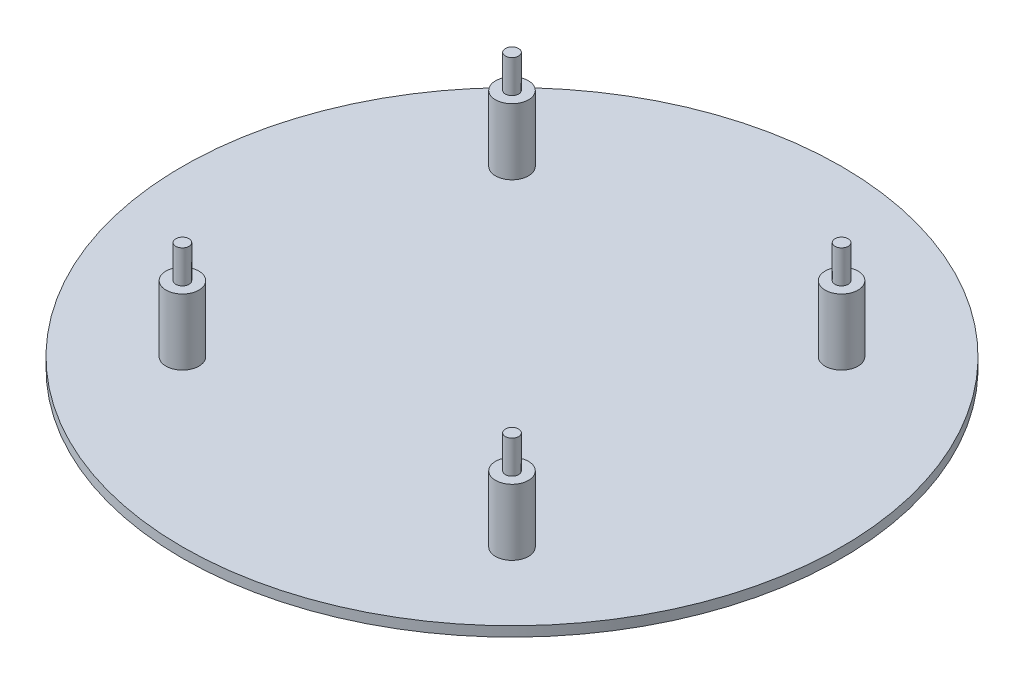
ISO-10303-21;
HEADER;
FILE_DESCRIPTION(('STEP AP214'),'2;1');
FILE_NAME('part.step','',(''),(''),'','','');
FILE_SCHEMA(('AUTOMOTIVE_DESIGN { 1 0 10303 214 1 1 1 1 }'));
ENDSEC;
DATA;
#1=APPLICATION_CONTEXT('core data for automotive mechanical design processes');
#2=APPLICATION_PROTOCOL_DEFINITION('international standard','automotive_design',2000,#1);
#3=PRODUCT_CONTEXT('',#1,'mechanical');
#4=PRODUCT('Part','Part','',(#3));
#5=PRODUCT_RELATED_PRODUCT_CATEGORY('part','',(#4));
#6=PRODUCT_DEFINITION_FORMATION('','',#4);
#7=PRODUCT_DEFINITION_CONTEXT('part definition',#1,'design');
#8=PRODUCT_DEFINITION('design','',#6,#7);
#9=PRODUCT_DEFINITION_SHAPE('','',#8);
#10=(LENGTH_UNIT() NAMED_UNIT(*) SI_UNIT(.MILLI.,.METRE.));
#11=(NAMED_UNIT(*) PLANE_ANGLE_UNIT() SI_UNIT($,.RADIAN.));
#12=(NAMED_UNIT(*) SI_UNIT($,.STERADIAN.) SOLID_ANGLE_UNIT());
#13=UNCERTAINTY_MEASURE_WITH_UNIT(LENGTH_MEASURE(1.E-05),#10,'distance_accuracy_value','');
#14=(GEOMETRIC_REPRESENTATION_CONTEXT(3) GLOBAL_UNCERTAINTY_ASSIGNED_CONTEXT((#13)) GLOBAL_UNIT_ASSIGNED_CONTEXT((#10,
#11,#12)) REPRESENTATION_CONTEXT('',''));
#15=CARTESIAN_POINT('',(0.,0.,0.));
#16=DIRECTION('',(0.,0.,1.));
#17=DIRECTION('',(1.,0.,0.));
#18=AXIS2_PLACEMENT_3D('',#15,#16,#17);
#19=CARTESIAN_POINT('',(0.,3.,0.));
#20=DIRECTION('',(0.,-1.,0.));
#21=DIRECTION('',(0.,0.,-1.));
#22=AXIS2_PLACEMENT_3D('',#19,#20,#21);
#23=CYLINDRICAL_SURFACE('',#22,100.);
#24=CARTESIAN_POINT('',(0.,3.,0.));
#25=DIRECTION('',(0.,1.,0.));
#26=DIRECTION('',(0.,0.,1.));
#27=AXIS2_PLACEMENT_3D('',#24,#25,#26);
#28=CIRCLE('',#27,100.);
#29=CARTESIAN_POINT('',(0.,3.,100.));
#30=VERTEX_POINT('',#29);
#31=EDGE_CURVE('E10',#30,#30,#28,.T.);
#32=ORIENTED_EDGE('',*,*,#31,.F.);
#33=EDGE_LOOP('',(#32));
#34=FACE_BOUND('',#33,.T.);
#35=CARTESIAN_POINT('',(0.,0.,0.));
#36=DIRECTION('',(0.,1.,0.));
#37=DIRECTION('',(0.,0.,1.));
#38=AXIS2_PLACEMENT_3D('',#35,#36,#37);
#39=CIRCLE('',#38,100.);
#40=CARTESIAN_POINT('',(0.,0.,100.));
#41=VERTEX_POINT('',#40);
#42=EDGE_CURVE('E34',#41,#41,#39,.T.);
#43=ORIENTED_EDGE('',*,*,#42,.T.);
#44=EDGE_LOOP('',(#43));
#45=FACE_BOUND('',#44,.T.);
#46=ADVANCED_FACE('F31',(#34,#45),#23,.T.);
#47=CARTESIAN_POINT('',(0.,3.,0.));
#48=DIRECTION('',(0.,1.,0.));
#49=DIRECTION('',(0.,0.,1.));
#50=AXIS2_PLACEMENT_3D('',#47,#48,#49);
#51=PLANE('',#50);
#52=CARTESIAN_POINT('',(-49.999999999999,3.,50.));
#53=DIRECTION('',(0.,1.,0.));
#54=DIRECTION('',(0.,0.,1.));
#55=AXIS2_PLACEMENT_3D('',#52,#53,#54);
#56=CIRCLE('',#55,5.);
#57=CARTESIAN_POINT('',(-49.999999999999,3.,55.));
#58=VERTEX_POINT('',#57);
#59=EDGE_CURVE('E61',#58,#58,#56,.T.);
#60=ORIENTED_EDGE('',*,*,#59,.F.);
#61=EDGE_LOOP('',(#60));
#62=FACE_BOUND('',#61,.T.);
#63=CARTESIAN_POINT('',(50.000000000001,3.,50.));
#64=DIRECTION('',(0.,1.,0.));
#65=DIRECTION('',(0.,0.,1.));
#66=AXIS2_PLACEMENT_3D('',#63,#64,#65);
#67=CIRCLE('',#66,5.);
#68=CARTESIAN_POINT('',(50.000000000001,3.,55.));
#69=VERTEX_POINT('',#68);
#70=EDGE_CURVE('E55',#69,#69,#67,.T.);
#71=ORIENTED_EDGE('',*,*,#70,.F.);
#72=EDGE_LOOP('',(#71));
#73=FACE_BOUND('',#72,.T.);
#74=CARTESIAN_POINT('',(50.,3.,-50.));
#75=DIRECTION('',(0.,1.,0.));
#76=DIRECTION('',(0.,0.,1.));
#77=AXIS2_PLACEMENT_3D('',#74,#75,#76);
#78=CIRCLE('',#77,5.);
#79=CARTESIAN_POINT('',(50.,3.,-45.));
#80=VERTEX_POINT('',#79);
#81=EDGE_CURVE('E49',#80,#80,#78,.T.);
#82=ORIENTED_EDGE('',*,*,#81,.F.);
#83=EDGE_LOOP('',(#82));
#84=FACE_BOUND('',#83,.T.);
#85=CARTESIAN_POINT('',(-50.,3.,-50.));
#86=DIRECTION('',(0.,1.,0.));
#87=DIRECTION('',(0.,0.,1.));
#88=AXIS2_PLACEMENT_3D('',#85,#86,#87);
#89=CIRCLE('',#88,5.);
#90=CARTESIAN_POINT('',(-50.,3.,-45.));
#91=VERTEX_POINT('',#90);
#92=EDGE_CURVE('E43',#91,#91,#89,.T.);
#93=ORIENTED_EDGE('',*,*,#92,.F.);
#94=EDGE_LOOP('',(#93));
#95=FACE_BOUND('',#94,.T.);
#96=ORIENTED_EDGE('',*,*,#31,.T.);
#97=EDGE_LOOP('',(#96));
#98=FACE_BOUND('',#97,.T.);
#99=ADVANCED_FACE('F114',(#62,#73,#84,#95,#98),#51,.T.);
#100=CARTESIAN_POINT('',(0.,0.,0.));
#101=DIRECTION('',(0.,1.,0.));
#102=DIRECTION('',(0.,0.,1.));
#103=AXIS2_PLACEMENT_3D('',#100,#101,#102);
#104=PLANE('',#103);
#105=ORIENTED_EDGE('',*,*,#42,.F.);
#106=EDGE_LOOP('',(#105));
#107=FACE_BOUND('',#106,.T.);
#108=ADVANCED_FACE('F117',(#107),#104,.F.);
#109=CARTESIAN_POINT('',(-50.,23.,-50.));
#110=DIRECTION('',(0.,-1.,0.));
#111=DIRECTION('',(0.,0.,-1.));
#112=AXIS2_PLACEMENT_3D('',#109,#110,#111);
#113=CYLINDRICAL_SURFACE('',#112,5.);
#114=CARTESIAN_POINT('',(-50.,23.,-50.));
#115=DIRECTION('',(0.,1.,0.));
#116=DIRECTION('',(0.,0.,1.));
#117=AXIS2_PLACEMENT_3D('',#114,#115,#116);
#118=CIRCLE('',#117,5.);
#119=CARTESIAN_POINT('',(-50.,23.,-45.));
#120=VERTEX_POINT('',#119);
#121=EDGE_CURVE('E41',#120,#120,#118,.T.);
#122=ORIENTED_EDGE('',*,*,#121,.F.);
#123=EDGE_LOOP('',(#122));
#124=FACE_BOUND('',#123,.T.);
#125=ORIENTED_EDGE('',*,*,#92,.T.);
#126=EDGE_LOOP('',(#125));
#127=FACE_BOUND('',#126,.T.);
#128=ADVANCED_FACE('F122',(#124,#127),#113,.T.);
#129=CARTESIAN_POINT('',(-50.,23.,-50.));
#130=DIRECTION('',(0.,1.,0.));
#131=DIRECTION('',(0.,0.,1.));
#132=AXIS2_PLACEMENT_3D('',#129,#130,#131);
#133=PLANE('',#132);
#134=CARTESIAN_POINT('',(-49.9999999999993,23.,-49.9999999999993));
#135=DIRECTION('',(0.,1.,0.));
#136=DIRECTION('',(0.,0.,1.));
#137=AXIS2_PLACEMENT_3D('',#134,#135,#136);
#138=CIRCLE('',#137,2.);
#139=CARTESIAN_POINT('',(-49.9999999999993,23.,-47.9999999999993));
#140=VERTEX_POINT('',#139);
#141=EDGE_CURVE('E79',#140,#140,#138,.T.);
#142=ORIENTED_EDGE('',*,*,#141,.F.);
#143=EDGE_LOOP('',(#142));
#144=FACE_BOUND('',#143,.T.);
#145=ORIENTED_EDGE('',*,*,#121,.T.);
#146=EDGE_LOOP('',(#145));
#147=FACE_BOUND('',#146,.T.);
#148=ADVANCED_FACE('F110',(#144,#147),#133,.T.);
#149=CARTESIAN_POINT('',(50.,23.,-50.));
#150=DIRECTION('',(0.,-1.,0.));
#151=DIRECTION('',(0.,0.,-1.));
#152=AXIS2_PLACEMENT_3D('',#149,#150,#151);
#153=CYLINDRICAL_SURFACE('',#152,5.);
#154=CARTESIAN_POINT('',(50.,23.,-50.));
#155=DIRECTION('',(0.,1.,0.));
#156=DIRECTION('',(0.,0.,1.));
#157=AXIS2_PLACEMENT_3D('',#154,#155,#156);
#158=CIRCLE('',#157,5.);
#159=CARTESIAN_POINT('',(50.,23.,-45.));
#160=VERTEX_POINT('',#159);
#161=EDGE_CURVE('E46',#160,#160,#158,.T.);
#162=ORIENTED_EDGE('',*,*,#161,.F.);
#163=EDGE_LOOP('',(#162));
#164=FACE_BOUND('',#163,.T.);
#165=ORIENTED_EDGE('',*,*,#81,.T.);
#166=EDGE_LOOP('',(#165));
#167=FACE_BOUND('',#166,.T.);
#168=ADVANCED_FACE('F104',(#164,#167),#153,.T.);
#169=CARTESIAN_POINT('',(50.,23.,-50.));
#170=DIRECTION('',(0.,1.,0.));
#171=DIRECTION('',(0.,0.,1.));
#172=AXIS2_PLACEMENT_3D('',#169,#170,#171);
#173=PLANE('',#172);
#174=CARTESIAN_POINT('',(50.0000000000007,23.,-50.));
#175=DIRECTION('',(0.,1.,0.));
#176=DIRECTION('',(0.,0.,1.));
#177=AXIS2_PLACEMENT_3D('',#174,#175,#176);
#178=CIRCLE('',#177,2.);
#179=CARTESIAN_POINT('',(50.0000000000007,23.,-48.));
#180=VERTEX_POINT('',#179);
#181=EDGE_CURVE('E85',#180,#180,#178,.T.);
#182=ORIENTED_EDGE('',*,*,#181,.F.);
#183=EDGE_LOOP('',(#182));
#184=FACE_BOUND('',#183,.T.);
#185=ORIENTED_EDGE('',*,*,#161,.T.);
#186=EDGE_LOOP('',(#185));
#187=FACE_BOUND('',#186,.T.);
#188=ADVANCED_FACE('F100',(#184,#187),#173,.T.);
#189=CARTESIAN_POINT('',(50.000000000001,23.,50.));
#190=DIRECTION('',(0.,-1.,0.));
#191=DIRECTION('',(0.,0.,-1.));
#192=AXIS2_PLACEMENT_3D('',#189,#190,#191);
#193=CYLINDRICAL_SURFACE('',#192,5.);
#194=CARTESIAN_POINT('',(50.000000000001,23.,50.));
#195=DIRECTION('',(0.,1.,0.));
#196=DIRECTION('',(0.,0.,1.));
#197=AXIS2_PLACEMENT_3D('',#194,#195,#196);
#198=CIRCLE('',#197,5.);
#199=CARTESIAN_POINT('',(50.000000000001,23.,55.));
#200=VERTEX_POINT('',#199);
#201=EDGE_CURVE('E52',#200,#200,#198,.T.);
#202=ORIENTED_EDGE('',*,*,#201,.F.);
#203=EDGE_LOOP('',(#202));
#204=FACE_BOUND('',#203,.T.);
#205=ORIENTED_EDGE('',*,*,#70,.T.);
#206=EDGE_LOOP('',(#205));
#207=FACE_BOUND('',#206,.T.);
#208=ADVANCED_FACE('F103',(#204,#207),#193,.T.);
#209=CARTESIAN_POINT('',(50.000000000001,23.,50.));
#210=DIRECTION('',(0.,1.,0.));
#211=DIRECTION('',(0.,0.,1.));
#212=AXIS2_PLACEMENT_3D('',#209,#210,#211);
#213=PLANE('',#212);
#214=CARTESIAN_POINT('',(50.000000000001,23.,50.));
#215=DIRECTION('',(0.,1.,0.));
#216=DIRECTION('',(0.,0.,1.));
#217=AXIS2_PLACEMENT_3D('',#214,#215,#216);
#218=CIRCLE('',#217,2.);
#219=CARTESIAN_POINT('',(50.000000000001,23.,52.));
#220=VERTEX_POINT('',#219);
#221=EDGE_CURVE('E67',#220,#220,#218,.T.);
#222=ORIENTED_EDGE('',*,*,#221,.F.);
#223=EDGE_LOOP('',(#222));
#224=FACE_BOUND('',#223,.T.);
#225=ORIENTED_EDGE('',*,*,#201,.T.);
#226=EDGE_LOOP('',(#225));
#227=FACE_BOUND('',#226,.T.);
#228=ADVANCED_FACE('F181',(#224,#227),#213,.T.);
#229=CARTESIAN_POINT('',(-49.999999999999,23.,50.));
#230=DIRECTION('',(0.,-1.,0.));
#231=DIRECTION('',(0.,0.,-1.));
#232=AXIS2_PLACEMENT_3D('',#229,#230,#231);
#233=CYLINDRICAL_SURFACE('',#232,5.);
#234=CARTESIAN_POINT('',(-49.999999999999,23.,50.));
#235=DIRECTION('',(0.,1.,0.));
#236=DIRECTION('',(0.,0.,1.));
#237=AXIS2_PLACEMENT_3D('',#234,#235,#236);
#238=CIRCLE('',#237,5.);
#239=CARTESIAN_POINT('',(-49.999999999999,23.,55.));
#240=VERTEX_POINT('',#239);
#241=EDGE_CURVE('E58',#240,#240,#238,.T.);
#242=ORIENTED_EDGE('',*,*,#241,.F.);
#243=EDGE_LOOP('',(#242));
#244=FACE_BOUND('',#243,.T.);
#245=ORIENTED_EDGE('',*,*,#59,.T.);
#246=EDGE_LOOP('',(#245));
#247=FACE_BOUND('',#246,.T.);
#248=ADVANCED_FACE('F189',(#244,#247),#233,.T.);
#249=CARTESIAN_POINT('',(-49.999999999999,23.,50.));
#250=DIRECTION('',(0.,1.,0.));
#251=DIRECTION('',(0.,0.,1.));
#252=AXIS2_PLACEMENT_3D('',#249,#250,#251);
#253=PLANE('',#252);
#254=CARTESIAN_POINT('',(-49.999999999999,23.,50.0000000000007));
#255=DIRECTION('',(0.,1.,0.));
#256=DIRECTION('',(0.,0.,1.));
#257=AXIS2_PLACEMENT_3D('',#254,#255,#256);
#258=CIRCLE('',#257,2.);
#259=CARTESIAN_POINT('',(-49.999999999999,23.,52.0000000000007));
#260=VERTEX_POINT('',#259);
#261=EDGE_CURVE('E73',#260,#260,#258,.T.);
#262=ORIENTED_EDGE('',*,*,#261,.F.);
#263=EDGE_LOOP('',(#262));
#264=FACE_BOUND('',#263,.T.);
#265=ORIENTED_EDGE('',*,*,#241,.T.);
#266=EDGE_LOOP('',(#265));
#267=FACE_BOUND('',#266,.T.);
#268=ADVANCED_FACE('F198',(#264,#267),#253,.T.);
#269=CARTESIAN_POINT('',(50.000000000001,33.,50.));
#270=DIRECTION('',(0.,-1.,0.));
#271=DIRECTION('',(0.,0.,-1.));
#272=AXIS2_PLACEMENT_3D('',#269,#270,#271);
#273=CYLINDRICAL_SURFACE('',#272,2.);
#274=CARTESIAN_POINT('',(50.000000000001,33.,50.));
#275=DIRECTION('',(0.,1.,0.));
#276=DIRECTION('',(0.,0.,1.));
#277=AXIS2_PLACEMENT_3D('',#274,#275,#276);
#278=CIRCLE('',#277,2.);
#279=CARTESIAN_POINT('',(50.000000000001,33.,52.));
#280=VERTEX_POINT('',#279);
#281=EDGE_CURVE('E64',#280,#280,#278,.T.);
#282=ORIENTED_EDGE('',*,*,#281,.F.);
#283=EDGE_LOOP('',(#282));
#284=FACE_BOUND('',#283,.T.);
#285=ORIENTED_EDGE('',*,*,#221,.T.);
#286=EDGE_LOOP('',(#285));
#287=FACE_BOUND('',#286,.T.);
#288=ADVANCED_FACE('F206',(#284,#287),#273,.T.);
#289=CARTESIAN_POINT('',(50.000000000001,33.,50.));
#290=DIRECTION('',(0.,1.,0.));
#291=DIRECTION('',(0.,0.,1.));
#292=AXIS2_PLACEMENT_3D('',#289,#290,#291);
#293=PLANE('',#292);
#294=ORIENTED_EDGE('',*,*,#281,.T.);
#295=EDGE_LOOP('',(#294));
#296=FACE_BOUND('',#295,.T.);
#297=ADVANCED_FACE('F215',(#296),#293,.T.);
#298=CARTESIAN_POINT('',(-49.999999999999,33.,50.0000000000007));
#299=DIRECTION('',(0.,-1.,0.));
#300=DIRECTION('',(0.,0.,-1.));
#301=AXIS2_PLACEMENT_3D('',#298,#299,#300);
#302=CYLINDRICAL_SURFACE('',#301,2.);
#303=CARTESIAN_POINT('',(-49.999999999999,33.,50.0000000000007));
#304=DIRECTION('',(0.,1.,0.));
#305=DIRECTION('',(0.,0.,1.));
#306=AXIS2_PLACEMENT_3D('',#303,#304,#305);
#307=CIRCLE('',#306,2.);
#308=CARTESIAN_POINT('',(-49.999999999999,33.,52.0000000000007));
#309=VERTEX_POINT('',#308);
#310=EDGE_CURVE('E70',#309,#309,#307,.T.);
#311=ORIENTED_EDGE('',*,*,#310,.F.);
#312=EDGE_LOOP('',(#311));
#313=FACE_BOUND('',#312,.T.);
#314=ORIENTED_EDGE('',*,*,#261,.T.);
#315=EDGE_LOOP('',(#314));
#316=FACE_BOUND('',#315,.T.);
#317=ADVANCED_FACE('F224',(#313,#316),#302,.T.);
#318=CARTESIAN_POINT('',(-49.999999999999,33.,50.0000000000007));
#319=DIRECTION('',(0.,1.,0.));
#320=DIRECTION('',(0.,0.,1.));
#321=AXIS2_PLACEMENT_3D('',#318,#319,#320);
#322=PLANE('',#321);
#323=ORIENTED_EDGE('',*,*,#310,.T.);
#324=EDGE_LOOP('',(#323));
#325=FACE_BOUND('',#324,.T.);
#326=ADVANCED_FACE('F233',(#325),#322,.T.);
#327=CARTESIAN_POINT('',(-49.9999999999993,33.,-49.9999999999993));
#328=DIRECTION('',(0.,-1.,0.));
#329=DIRECTION('',(0.,0.,-1.));
#330=AXIS2_PLACEMENT_3D('',#327,#328,#329);
#331=CYLINDRICAL_SURFACE('',#330,2.);
#332=CARTESIAN_POINT('',(-49.9999999999993,33.,-49.9999999999993));
#333=DIRECTION('',(0.,1.,0.));
#334=DIRECTION('',(0.,0.,1.));
#335=AXIS2_PLACEMENT_3D('',#332,#333,#334);
#336=CIRCLE('',#335,2.);
#337=CARTESIAN_POINT('',(-49.9999999999993,33.,-47.9999999999993));
#338=VERTEX_POINT('',#337);
#339=EDGE_CURVE('E76',#338,#338,#336,.T.);
#340=ORIENTED_EDGE('',*,*,#339,.F.);
#341=EDGE_LOOP('',(#340));
#342=FACE_BOUND('',#341,.T.);
#343=ORIENTED_EDGE('',*,*,#141,.T.);
#344=EDGE_LOOP('',(#343));
#345=FACE_BOUND('',#344,.T.);
#346=ADVANCED_FACE('F242',(#342,#345),#331,.T.);
#347=CARTESIAN_POINT('',(-49.9999999999993,33.,-49.9999999999993));
#348=DIRECTION('',(0.,1.,0.));
#349=DIRECTION('',(0.,0.,1.));
#350=AXIS2_PLACEMENT_3D('',#347,#348,#349);
#351=PLANE('',#350);
#352=ORIENTED_EDGE('',*,*,#339,.T.);
#353=EDGE_LOOP('',(#352));
#354=FACE_BOUND('',#353,.T.);
#355=ADVANCED_FACE('F96',(#354),#351,.T.);
#356=CARTESIAN_POINT('',(50.0000000000007,33.,-50.));
#357=DIRECTION('',(0.,-1.,0.));
#358=DIRECTION('',(0.,0.,-1.));
#359=AXIS2_PLACEMENT_3D('',#356,#357,#358);
#360=CYLINDRICAL_SURFACE('',#359,2.);
#361=CARTESIAN_POINT('',(50.0000000000007,33.,-50.));
#362=DIRECTION('',(0.,1.,0.));
#363=DIRECTION('',(0.,0.,1.));
#364=AXIS2_PLACEMENT_3D('',#361,#362,#363);
#365=CIRCLE('',#364,2.);
#366=CARTESIAN_POINT('',(50.0000000000007,33.,-48.));
#367=VERTEX_POINT('',#366);
#368=EDGE_CURVE('E82',#367,#367,#365,.T.);
#369=ORIENTED_EDGE('',*,*,#368,.F.);
#370=EDGE_LOOP('',(#369));
#371=FACE_BOUND('',#370,.T.);
#372=ORIENTED_EDGE('',*,*,#181,.T.);
#373=EDGE_LOOP('',(#372));
#374=FACE_BOUND('',#373,.T.);
#375=ADVANCED_FACE('F93',(#371,#374),#360,.T.);
#376=CARTESIAN_POINT('',(50.0000000000007,33.,-50.));
#377=DIRECTION('',(0.,1.,0.));
#378=DIRECTION('',(0.,0.,1.));
#379=AXIS2_PLACEMENT_3D('',#376,#377,#378);
#380=PLANE('',#379);
#381=ORIENTED_EDGE('',*,*,#368,.T.);
#382=EDGE_LOOP('',(#381));
#383=FACE_BOUND('',#382,.T.);
#384=ADVANCED_FACE('F91',(#383),#380,.T.);
#385=CLOSED_SHELL('',(#46,#99,#108,#128,#148,#168,#188,#208,#228,#248,#268,#288,#297,#317,#326,
#346,#355,#375,#384));
#386=MANIFOLD_SOLID_BREP('B2',#385);
#387=ADVANCED_BREP_SHAPE_REPRESENTATION('',(#18,#386),#14);
#388=SHAPE_DEFINITION_REPRESENTATION(#9,#387);
ENDSEC;
END-ISO-10303-21;
